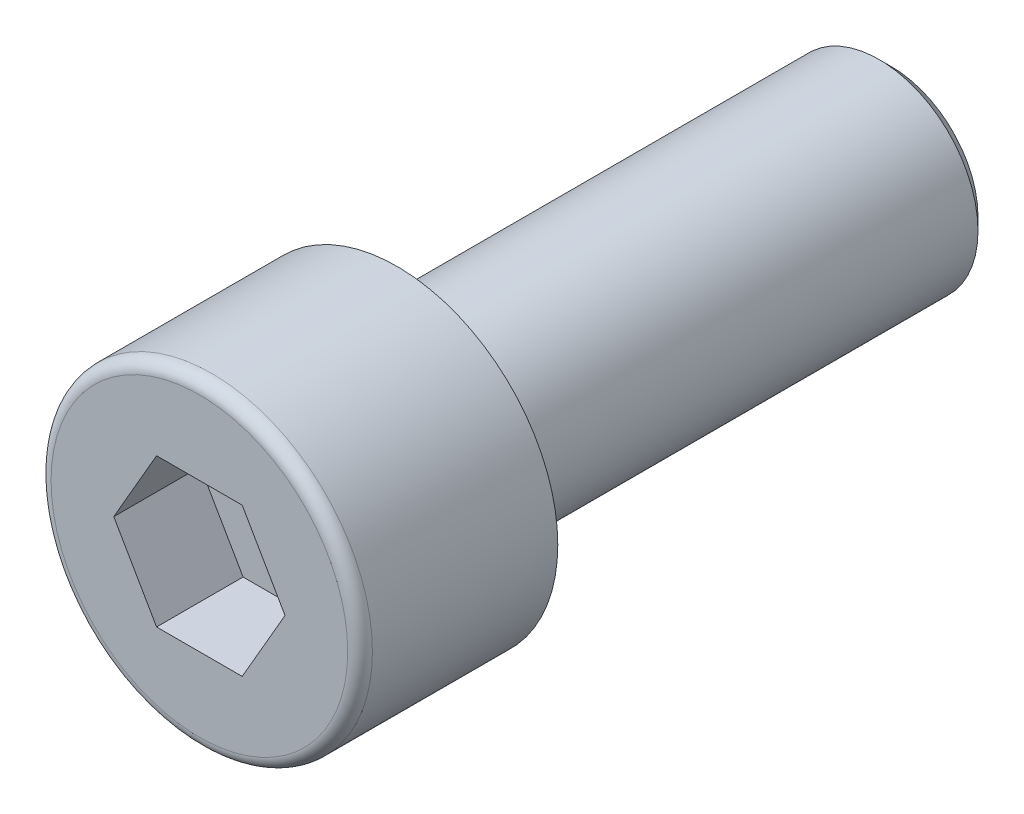
ISO-10303-21;
HEADER;
FILE_DESCRIPTION(('STEP AP214'),'2;1');
FILE_NAME('part.step','',(''),(''),'','','');
FILE_SCHEMA(('AUTOMOTIVE_DESIGN { 1 0 10303 214 1 1 1 1 }'));
ENDSEC;
DATA;
#1=APPLICATION_CONTEXT('core data for automotive mechanical design processes');
#2=APPLICATION_PROTOCOL_DEFINITION('international standard','automotive_design',2000,#1);
#3=PRODUCT_CONTEXT('',#1,'mechanical');
#4=PRODUCT('Part','Part','',(#3));
#5=PRODUCT_RELATED_PRODUCT_CATEGORY('part','',(#4));
#6=PRODUCT_DEFINITION_FORMATION('','',#4);
#7=PRODUCT_DEFINITION_CONTEXT('part definition',#1,'design');
#8=PRODUCT_DEFINITION('design','',#6,#7);
#9=PRODUCT_DEFINITION_SHAPE('','',#8);
#10=(LENGTH_UNIT() NAMED_UNIT(*) SI_UNIT(.MILLI.,.METRE.));
#11=(NAMED_UNIT(*) PLANE_ANGLE_UNIT() SI_UNIT($,.RADIAN.));
#12=(NAMED_UNIT(*) SI_UNIT($,.STERADIAN.) SOLID_ANGLE_UNIT());
#13=UNCERTAINTY_MEASURE_WITH_UNIT(LENGTH_MEASURE(1.E-05),#10,'distance_accuracy_value','');
#14=(GEOMETRIC_REPRESENTATION_CONTEXT(3) GLOBAL_UNCERTAINTY_ASSIGNED_CONTEXT((#13)) GLOBAL_UNIT_ASSIGNED_CONTEXT((#10,
#11,#12)) REPRESENTATION_CONTEXT('',''));
#15=CARTESIAN_POINT('',(0.,0.,0.));
#16=DIRECTION('',(0.,0.,1.));
#17=DIRECTION('',(1.,0.,0.));
#18=AXIS2_PLACEMENT_3D('',#15,#16,#17);
#19=CARTESIAN_POINT('',(0.,0.,20.));
#20=DIRECTION('',(0.,0.,-1.));
#21=DIRECTION('',(-1.,0.,0.));
#22=AXIS2_PLACEMENT_3D('',#19,#20,#21);
#23=CYLINDRICAL_SURFACE('',#22,4.);
#24=CARTESIAN_POINT('',(0.,0.,0.500000000000007));
#25=DIRECTION('',(0.,0.,1.));
#26=DIRECTION('',(1.,0.,0.));
#27=AXIS2_PLACEMENT_3D('',#24,#25,#26);
#28=CIRCLE('',#27,4.);
#29=CARTESIAN_POINT('',(4.,0.,0.500000000000007));
#30=VERTEX_POINT('',#29);
#31=EDGE_CURVE('E40',#30,#30,#28,.T.);
#32=ORIENTED_EDGE('',*,*,#31,.T.);
#33=EDGE_LOOP('',(#32));
#34=FACE_BOUND('',#33,.T.);
#35=CARTESIAN_POINT('',(0.,0.,20.));
#36=DIRECTION('',(0.,0.,1.));
#37=DIRECTION('',(1.,0.,0.));
#38=AXIS2_PLACEMENT_3D('',#35,#36,#37);
#39=CIRCLE('',#38,4.);
#40=CARTESIAN_POINT('',(4.,0.,20.));
#41=VERTEX_POINT('',#40);
#42=EDGE_CURVE('E143',#41,#41,#39,.T.);
#43=ORIENTED_EDGE('',*,*,#42,.F.);
#44=EDGE_LOOP('',(#43));
#45=FACE_BOUND('',#44,.T.);
#46=ADVANCED_FACE('F33',(#34,#45),#23,.T.);
#47=CARTESIAN_POINT('',(0.,0.,0.));
#48=DIRECTION('',(0.,0.,1.));
#49=DIRECTION('',(1.,0.,0.));
#50=AXIS2_PLACEMENT_3D('',#47,#48,#49);
#51=PLANE('',#50);
#52=CARTESIAN_POINT('',(0.,0.,0.));
#53=DIRECTION('',(0.,0.,1.));
#54=DIRECTION('',(1.,0.,0.));
#55=AXIS2_PLACEMENT_3D('',#52,#53,#54);
#56=CIRCLE('',#55,3.5);
#57=CARTESIAN_POINT('',(3.5,0.,0.));
#58=VERTEX_POINT('',#57);
#59=EDGE_CURVE('E11',#58,#58,#56,.F.);
#60=ORIENTED_EDGE('',*,*,#59,.T.);
#61=EDGE_LOOP('',(#60));
#62=FACE_BOUND('',#61,.T.);
#63=ADVANCED_FACE('F169',(#62),#51,.F.);
#64=CARTESIAN_POINT('',(0.,0.,20.));
#65=DIRECTION('',(0.,0.,1.));
#66=DIRECTION('',(1.,0.,0.));
#67=AXIS2_PLACEMENT_3D('',#64,#65,#66);
#68=PLANE('',#67);
#69=CARTESIAN_POINT('',(0.,0.,20.));
#70=DIRECTION('',(0.,0.,1.));
#71=DIRECTION('',(1.,0.,0.));
#72=AXIS2_PLACEMENT_3D('',#69,#70,#71);
#73=CIRCLE('',#72,6.5);
#74=CARTESIAN_POINT('',(6.5,0.,20.));
#75=VERTEX_POINT('',#74);
#76=EDGE_CURVE('E134',#75,#75,#73,.T.);
#77=ORIENTED_EDGE('',*,*,#76,.F.);
#78=EDGE_LOOP('',(#77));
#79=FACE_BOUND('',#78,.T.);
#80=ORIENTED_EDGE('',*,*,#42,.T.);
#81=EDGE_LOOP('',(#80));
#82=FACE_BOUND('',#81,.T.);
#83=ADVANCED_FACE('F173',(#79,#82),#68,.F.);
#84=CARTESIAN_POINT('',(0.,0.,28.));
#85=DIRECTION('',(0.,0.,-1.));
#86=DIRECTION('',(-1.,0.,0.));
#87=AXIS2_PLACEMENT_3D('',#84,#85,#86);
#88=CYLINDRICAL_SURFACE('',#87,6.5);
#89=CARTESIAN_POINT('',(0.,0.,27.5));
#90=DIRECTION('',(0.,0.,1.));
#91=DIRECTION('',(1.,0.,0.));
#92=AXIS2_PLACEMENT_3D('',#89,#90,#91);
#93=CIRCLE('',#92,6.5);
#94=CARTESIAN_POINT('',(6.5,0.,27.5));
#95=VERTEX_POINT('',#94);
#96=EDGE_CURVE('E149',#95,#95,#93,.F.);
#97=ORIENTED_EDGE('',*,*,#96,.T.);
#98=EDGE_LOOP('',(#97));
#99=FACE_BOUND('',#98,.T.);
#100=ORIENTED_EDGE('',*,*,#76,.T.);
#101=EDGE_LOOP('',(#100));
#102=FACE_BOUND('',#101,.T.);
#103=ADVANCED_FACE('F178',(#99,#102),#88,.T.);
#104=CARTESIAN_POINT('',(0.,0.,28.));
#105=DIRECTION('',(0.,0.,1.));
#106=DIRECTION('',(1.,0.,0.));
#107=AXIS2_PLACEMENT_3D('',#104,#105,#106);
#108=PLANE('',#107);
#109=CARTESIAN_POINT('',(0.,0.,28.));
#110=DIRECTION('',(0.,0.,1.));
#111=DIRECTION('',(1.,0.,0.));
#112=AXIS2_PLACEMENT_3D('',#109,#110,#111);
#113=CIRCLE('',#112,6.);
#114=CARTESIAN_POINT('',(6.,0.,28.));
#115=VERTEX_POINT('',#114);
#116=EDGE_CURVE('E146',#115,#115,#113,.T.);
#117=ORIENTED_EDGE('',*,*,#116,.T.);
#118=EDGE_LOOP('',(#117));
#119=FACE_BOUND('',#118,.T.);
#120=DIRECTION('',(0.5,0.866025403784439,0.));
#121=VECTOR('',#120,1.);
#122=CARTESIAN_POINT('',(3.46410161513775,0.,28.));
#123=LINE('',#122,#121);
#124=CARTESIAN_POINT('',(1.73205080756888,-3.,28.));
#125=VERTEX_POINT('',#124);
#126=CARTESIAN_POINT('',(3.46410161513775,0.,28.));
#127=VERTEX_POINT('',#126);
#128=EDGE_CURVE('E47',#125,#127,#123,.T.);
#129=ORIENTED_EDGE('',*,*,#128,.F.);
#130=DIRECTION('',(1.,0.,0.));
#131=VECTOR('',#130,1.);
#132=CARTESIAN_POINT('',(-1.73205080756888,-3.,28.));
#133=LINE('',#132,#131);
#134=CARTESIAN_POINT('',(-1.73205080756888,-3.,28.));
#135=VERTEX_POINT('',#134);
#136=EDGE_CURVE('E116',#135,#125,#133,.T.);
#137=ORIENTED_EDGE('',*,*,#136,.F.);
#138=DIRECTION('',(0.5,-0.866025403784439,0.));
#139=VECTOR('',#138,1.);
#140=CARTESIAN_POINT('',(-3.46410161513775,0.,28.));
#141=LINE('',#140,#139);
#142=CARTESIAN_POINT('',(-3.46410161513775,0.,28.));
#143=VERTEX_POINT('',#142);
#144=EDGE_CURVE('E110',#143,#135,#141,.T.);
#145=ORIENTED_EDGE('',*,*,#144,.F.);
#146=DIRECTION('',(-0.5,-0.866025403784439,0.));
#147=VECTOR('',#146,1.);
#148=CARTESIAN_POINT('',(-3.46410161513775,0.,28.));
#149=LINE('',#148,#147);
#150=CARTESIAN_POINT('',(-1.73205080756888,3.,28.));
#151=VERTEX_POINT('',#150);
#152=EDGE_CURVE('E108',#151,#143,#149,.T.);
#153=ORIENTED_EDGE('',*,*,#152,.F.);
#154=DIRECTION('',(-1.,0.,0.));
#155=VECTOR('',#154,1.);
#156=CARTESIAN_POINT('',(-1.73205080756888,3.,28.));
#157=LINE('',#156,#155);
#158=CARTESIAN_POINT('',(1.73205080756888,3.,28.));
#159=VERTEX_POINT('',#158);
#160=EDGE_CURVE('E90',#159,#151,#157,.T.);
#161=ORIENTED_EDGE('',*,*,#160,.F.);
#162=DIRECTION('',(-0.5,0.866025403784439,0.));
#163=VECTOR('',#162,1.);
#164=CARTESIAN_POINT('',(3.46410161513775,0.,28.));
#165=LINE('',#164,#163);
#166=EDGE_CURVE('E101',#127,#159,#165,.T.);
#167=ORIENTED_EDGE('',*,*,#166,.F.);
#168=EDGE_LOOP('',(#129,#137,#145,#153,#161,#167));
#169=FACE_BOUND('',#168,.T.);
#170=ADVANCED_FACE('F105',(#119,#169),#108,.T.);
#171=CARTESIAN_POINT('',(3.46410161513775,0.,24.5));
#172=DIRECTION('',(0.866025403784439,-0.5,0.));
#173=DIRECTION('',(0.5,0.866025403784439,0.));
#174=AXIS2_PLACEMENT_3D('',#171,#172,#173);
#175=PLANE('',#174);
#176=ORIENTED_EDGE('',*,*,#128,.T.);
#177=DIRECTION('',(0.,0.,1.));
#178=VECTOR('',#177,1.);
#179=CARTESIAN_POINT('',(3.46410161513775,0.,24.5));
#180=LINE('',#179,#178);
#181=CARTESIAN_POINT('',(3.46410161513775,0.,24.5));
#182=VERTEX_POINT('',#181);
#183=EDGE_CURVE('E98',#182,#127,#180,.T.);
#184=ORIENTED_EDGE('',*,*,#183,.F.);
#185=DIRECTION('',(0.5,0.866025403784439,0.));
#186=VECTOR('',#185,1.);
#187=CARTESIAN_POINT('',(3.46410161513775,0.,24.5));
#188=LINE('',#187,#186);
#189=CARTESIAN_POINT('',(1.73205080756888,-3.,24.5));
#190=VERTEX_POINT('',#189);
#191=EDGE_CURVE('E118',#190,#182,#188,.T.);
#192=ORIENTED_EDGE('',*,*,#191,.F.);
#193=DIRECTION('',(0.,0.,1.));
#194=VECTOR('',#193,1.);
#195=CARTESIAN_POINT('',(1.73205080756888,-3.,24.5));
#196=LINE('',#195,#194);
#197=EDGE_CURVE('E54',#190,#125,#196,.T.);
#198=ORIENTED_EDGE('',*,*,#197,.T.);
#199=EDGE_LOOP('',(#176,#184,#192,#198));
#200=FACE_BOUND('',#199,.T.);
#201=ADVANCED_FACE('F186',(#200),#175,.F.);
#202=CARTESIAN_POINT('',(-1.73205080756888,-3.,24.5));
#203=DIRECTION('',(0.,-1.,0.));
#204=DIRECTION('',(0.,0.,-1.));
#205=AXIS2_PLACEMENT_3D('',#202,#203,#204);
#206=PLANE('',#205);
#207=ORIENTED_EDGE('',*,*,#136,.T.);
#208=ORIENTED_EDGE('',*,*,#197,.F.);
#209=DIRECTION('',(1.,0.,0.));
#210=VECTOR('',#209,1.);
#211=CARTESIAN_POINT('',(-1.73205080756888,-3.,24.5));
#212=LINE('',#211,#210);
#213=CARTESIAN_POINT('',(-1.73205080756888,-3.,24.5));
#214=VERTEX_POINT('',#213);
#215=EDGE_CURVE('E130',#214,#190,#212,.T.);
#216=ORIENTED_EDGE('',*,*,#215,.F.);
#217=DIRECTION('',(0.,0.,1.));
#218=VECTOR('',#217,1.);
#219=CARTESIAN_POINT('',(-1.73205080756888,-3.,24.5));
#220=LINE('',#219,#218);
#221=EDGE_CURVE('E135',#214,#135,#220,.T.);
#222=ORIENTED_EDGE('',*,*,#221,.T.);
#223=EDGE_LOOP('',(#207,#208,#216,#222));
#224=FACE_BOUND('',#223,.T.);
#225=ADVANCED_FACE('F191',(#224),#206,.F.);
#226=CARTESIAN_POINT('',(-3.46410161513775,0.,24.5));
#227=DIRECTION('',(-0.866025403784439,-0.5,0.));
#228=DIRECTION('',(0.5,-0.866025403784439,0.));
#229=AXIS2_PLACEMENT_3D('',#226,#227,#228);
#230=PLANE('',#229);
#231=ORIENTED_EDGE('',*,*,#144,.T.);
#232=ORIENTED_EDGE('',*,*,#221,.F.);
#233=DIRECTION('',(0.5,-0.866025403784439,0.));
#234=VECTOR('',#233,1.);
#235=CARTESIAN_POINT('',(-3.46410161513775,0.,24.5));
#236=LINE('',#235,#234);
#237=CARTESIAN_POINT('',(-3.46410161513775,0.,24.5));
#238=VERTEX_POINT('',#237);
#239=EDGE_CURVE('E127',#238,#214,#236,.T.);
#240=ORIENTED_EDGE('',*,*,#239,.F.);
#241=DIRECTION('',(0.,0.,1.));
#242=VECTOR('',#241,1.);
#243=CARTESIAN_POINT('',(-3.46410161513775,0.,24.5));
#244=LINE('',#243,#242);
#245=EDGE_CURVE('E137',#238,#143,#244,.T.);
#246=ORIENTED_EDGE('',*,*,#245,.T.);
#247=EDGE_LOOP('',(#231,#232,#240,#246));
#248=FACE_BOUND('',#247,.T.);
#249=ADVANCED_FACE('F199',(#248),#230,.F.);
#250=CARTESIAN_POINT('',(-3.46410161513775,0.,24.5));
#251=DIRECTION('',(-0.866025403784439,0.5,0.));
#252=DIRECTION('',(-0.5,-0.866025403784439,0.));
#253=AXIS2_PLACEMENT_3D('',#250,#251,#252);
#254=PLANE('',#253);
#255=ORIENTED_EDGE('',*,*,#152,.T.);
#256=ORIENTED_EDGE('',*,*,#245,.F.);
#257=DIRECTION('',(-0.5,-0.866025403784439,0.));
#258=VECTOR('',#257,1.);
#259=CARTESIAN_POINT('',(-3.46410161513775,0.,24.5));
#260=LINE('',#259,#258);
#261=CARTESIAN_POINT('',(-1.73205080756888,3.,24.5));
#262=VERTEX_POINT('',#261);
#263=EDGE_CURVE('E124',#262,#238,#260,.T.);
#264=ORIENTED_EDGE('',*,*,#263,.F.);
#265=DIRECTION('',(0.,0.,1.));
#266=VECTOR('',#265,1.);
#267=CARTESIAN_POINT('',(-1.73205080756888,3.,24.5));
#268=LINE('',#267,#266);
#269=EDGE_CURVE('E97',#262,#151,#268,.T.);
#270=ORIENTED_EDGE('',*,*,#269,.T.);
#271=EDGE_LOOP('',(#255,#256,#264,#270));
#272=FACE_BOUND('',#271,.T.);
#273=ADVANCED_FACE('F196',(#272),#254,.F.);
#274=CARTESIAN_POINT('',(-1.73205080756888,3.,24.5));
#275=DIRECTION('',(0.,1.,0.));
#276=DIRECTION('',(0.,0.,1.));
#277=AXIS2_PLACEMENT_3D('',#274,#275,#276);
#278=PLANE('',#277);
#279=ORIENTED_EDGE('',*,*,#160,.T.);
#280=ORIENTED_EDGE('',*,*,#269,.F.);
#281=DIRECTION('',(-1.,0.,0.));
#282=VECTOR('',#281,1.);
#283=CARTESIAN_POINT('',(-1.73205080756888,3.,24.5));
#284=LINE('',#283,#282);
#285=CARTESIAN_POINT('',(1.73205080756888,3.,24.5));
#286=VERTEX_POINT('',#285);
#287=EDGE_CURVE('E93',#286,#262,#284,.T.);
#288=ORIENTED_EDGE('',*,*,#287,.F.);
#289=DIRECTION('',(0.,0.,1.));
#290=VECTOR('',#289,1.);
#291=CARTESIAN_POINT('',(1.73205080756888,3.,24.5));
#292=LINE('',#291,#290);
#293=EDGE_CURVE('E86',#286,#159,#292,.T.);
#294=ORIENTED_EDGE('',*,*,#293,.T.);
#295=EDGE_LOOP('',(#279,#280,#288,#294));
#296=FACE_BOUND('',#295,.T.);
#297=ADVANCED_FACE('F88',(#296),#278,.F.);
#298=CARTESIAN_POINT('',(3.46410161513775,0.,24.5));
#299=DIRECTION('',(0.866025403784439,0.5,0.));
#300=DIRECTION('',(-0.5,0.866025403784439,0.));
#301=AXIS2_PLACEMENT_3D('',#298,#299,#300);
#302=PLANE('',#301);
#303=ORIENTED_EDGE('',*,*,#166,.T.);
#304=ORIENTED_EDGE('',*,*,#293,.F.);
#305=DIRECTION('',(-0.5,0.866025403784439,0.));
#306=VECTOR('',#305,1.);
#307=CARTESIAN_POINT('',(3.46410161513775,0.,24.5));
#308=LINE('',#307,#306);
#309=EDGE_CURVE('E121',#182,#286,#308,.T.);
#310=ORIENTED_EDGE('',*,*,#309,.F.);
#311=ORIENTED_EDGE('',*,*,#183,.T.);
#312=EDGE_LOOP('',(#303,#304,#310,#311));
#313=FACE_BOUND('',#312,.T.);
#314=ADVANCED_FACE('F102',(#313),#302,.F.);
#315=CARTESIAN_POINT('',(1.73205080756888,-3.,24.5));
#316=DIRECTION('',(0.,0.,1.));
#317=DIRECTION('',(1.,0.,0.));
#318=AXIS2_PLACEMENT_3D('',#315,#316,#317);
#319=PLANE('',#318);
#320=ORIENTED_EDGE('',*,*,#191,.T.);
#321=ORIENTED_EDGE('',*,*,#309,.T.);
#322=ORIENTED_EDGE('',*,*,#287,.T.);
#323=ORIENTED_EDGE('',*,*,#263,.T.);
#324=ORIENTED_EDGE('',*,*,#239,.T.);
#325=ORIENTED_EDGE('',*,*,#215,.T.);
#326=EDGE_LOOP('',(#320,#321,#322,#323,#324,#325));
#327=FACE_BOUND('',#326,.T.);
#328=ADVANCED_FACE('F164',(#327),#319,.T.);
#329=CARTESIAN_POINT('',(0.,0.,27.5));
#330=DIRECTION('',(0.,0.,1.));
#331=DIRECTION('',(1.,0.,0.));
#332=AXIS2_PLACEMENT_3D('',#329,#330,#331);
#333=TOROIDAL_SURFACE('',#332,6.,0.5);
#334=ORIENTED_EDGE('',*,*,#96,.F.);
#335=EDGE_LOOP('',(#334));
#336=FACE_BOUND('',#335,.T.);
#337=ORIENTED_EDGE('',*,*,#116,.F.);
#338=EDGE_LOOP('',(#337));
#339=FACE_BOUND('',#338,.T.);
#340=ADVANCED_FACE('F158',(#336,#339),#333,.T.);
#341=CARTESIAN_POINT('',(0.,0.,0.500000000000007));
#342=DIRECTION('',(0.,0.,1.));
#343=DIRECTION('',(1.,0.,0.));
#344=AXIS2_PLACEMENT_3D('',#341,#342,#343);
#345=CONICAL_SURFACE('',#344,4.,0.785398163397445);
#346=ORIENTED_EDGE('',*,*,#59,.F.);
#347=EDGE_LOOP('',(#346));
#348=FACE_BOUND('',#347,.T.);
#349=ORIENTED_EDGE('',*,*,#31,.F.);
#350=EDGE_LOOP('',(#349));
#351=FACE_BOUND('',#350,.T.);
#352=ADVANCED_FACE('F156',(#348,#351),#345,.T.);
#353=CLOSED_SHELL('',(#46,#63,#83,#103,#170,#201,#225,#249,#273,#297,#314,#328,#340,#352));
#354=MANIFOLD_SOLID_BREP('B2',#353);
#355=ADVANCED_BREP_SHAPE_REPRESENTATION('',(#18,#354),#14);
#356=SHAPE_DEFINITION_REPRESENTATION(#9,#355);
ENDSEC;
END-ISO-10303-21;
